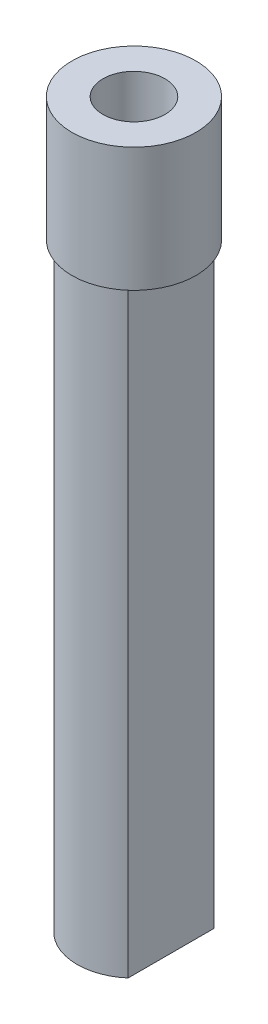
ISO-10303-21;
HEADER;
FILE_DESCRIPTION(('STEP AP214'),'2;1');
FILE_NAME('part.step','',(''),(''),'','','');
FILE_SCHEMA(('AUTOMOTIVE_DESIGN { 1 0 10303 214 1 1 1 1 }'));
ENDSEC;
DATA;
#1=APPLICATION_CONTEXT('core data for automotive mechanical design processes');
#2=APPLICATION_PROTOCOL_DEFINITION('international standard','automotive_design',2000,#1);
#3=PRODUCT_CONTEXT('',#1,'mechanical');
#4=PRODUCT('Part','Part','',(#3));
#5=PRODUCT_RELATED_PRODUCT_CATEGORY('part','',(#4));
#6=PRODUCT_DEFINITION_FORMATION('','',#4);
#7=PRODUCT_DEFINITION_CONTEXT('part definition',#1,'design');
#8=PRODUCT_DEFINITION('design','',#6,#7);
#9=PRODUCT_DEFINITION_SHAPE('','',#8);
#10=(LENGTH_UNIT() NAMED_UNIT(*) SI_UNIT(.MILLI.,.METRE.));
#11=(NAMED_UNIT(*) PLANE_ANGLE_UNIT() SI_UNIT($,.RADIAN.));
#12=(NAMED_UNIT(*) SI_UNIT($,.STERADIAN.) SOLID_ANGLE_UNIT());
#13=UNCERTAINTY_MEASURE_WITH_UNIT(LENGTH_MEASURE(1.E-05),#10,'distance_accuracy_value','');
#14=(GEOMETRIC_REPRESENTATION_CONTEXT(3) GLOBAL_UNCERTAINTY_ASSIGNED_CONTEXT((#13)) GLOBAL_UNIT_ASSIGNED_CONTEXT((#10,
#11,#12)) REPRESENTATION_CONTEXT('',''));
#15=CARTESIAN_POINT('',(0.,0.,0.));
#16=DIRECTION('',(0.,0.,1.));
#17=DIRECTION('',(1.,0.,0.));
#18=AXIS2_PLACEMENT_3D('',#15,#16,#17);
#19=CARTESIAN_POINT('',(0.,0.,0.));
#20=DIRECTION('',(0.,1.,0.));
#21=DIRECTION('',(0.,0.,1.));
#22=AXIS2_PLACEMENT_3D('',#19,#20,#21);
#23=PLANE('',#22);
#24=CARTESIAN_POINT('',(0.,0.,0.));
#25=DIRECTION('',(0.,1.,0.));
#26=DIRECTION('',(0.,0.,1.));
#27=AXIS2_PLACEMENT_3D('',#24,#25,#26);
#28=CIRCLE('',#27,3.);
#29=CARTESIAN_POINT('',(0.,0.,3.));
#30=VERTEX_POINT('',#29);
#31=EDGE_CURVE('E49',#30,#30,#28,.T.);
#32=ORIENTED_EDGE('',*,*,#31,.F.);
#33=EDGE_LOOP('',(#32));
#34=FACE_BOUND('',#33,.T.);
#35=CARTESIAN_POINT('',(0.,0.,0.));
#36=DIRECTION('',(0.,-1.,0.));
#37=DIRECTION('',(0.,0.,-1.));
#38=AXIS2_PLACEMENT_3D('',#35,#36,#37);
#39=CIRCLE('',#38,2.75);
#40=CARTESIAN_POINT('',(1.79891634046723,0.,2.08));
#41=VERTEX_POINT('',#40);
#42=CARTESIAN_POINT('',(-1.79891634046723,0.,2.08));
#43=VERTEX_POINT('',#42);
#44=EDGE_CURVE('E115',#41,#43,#39,.T.);
#45=ORIENTED_EDGE('',*,*,#44,.F.);
#46=DIRECTION('',(0.,0.,-1.));
#47=VECTOR('',#46,1.);
#48=CARTESIAN_POINT('',(1.79891634046723,0.,0.));
#49=LINE('',#48,#47);
#50=CARTESIAN_POINT('',(1.79891634046723,0.,-2.08));
#51=VERTEX_POINT('',#50);
#52=EDGE_CURVE('E61',#41,#51,#49,.T.);
#53=ORIENTED_EDGE('',*,*,#52,.T.);
#54=CARTESIAN_POINT('',(-1.79891634046723,0.,-2.08));
#55=VERTEX_POINT('',#54);
#56=EDGE_CURVE('E66',#55,#51,#39,.T.);
#57=ORIENTED_EDGE('',*,*,#56,.F.);
#58=DIRECTION('',(0.,0.,-1.));
#59=VECTOR('',#58,1.);
#60=CARTESIAN_POINT('',(-1.79891634046723,0.,0.));
#61=LINE('',#60,#59);
#62=EDGE_CURVE('E113',#43,#55,#61,.T.);
#63=ORIENTED_EDGE('',*,*,#62,.F.);
#64=EDGE_LOOP('',(#45,#53,#57,#63));
#65=FACE_BOUND('',#64,.T.);
#66=ADVANCED_FACE('F45',(#34,#65),#23,.F.);
#67=CARTESIAN_POINT('',(0.,6.,0.));
#68=DIRECTION('',(0.,-1.,0.));
#69=DIRECTION('',(0.,0.,-1.));
#70=AXIS2_PLACEMENT_3D('',#67,#68,#69);
#71=CYLINDRICAL_SURFACE('',#70,3.);
#72=CARTESIAN_POINT('',(0.,6.,0.));
#73=DIRECTION('',(0.,1.,0.));
#74=DIRECTION('',(0.,0.,1.));
#75=AXIS2_PLACEMENT_3D('',#72,#73,#74);
#76=CIRCLE('',#75,3.);
#77=CARTESIAN_POINT('',(0.,6.,3.));
#78=VERTEX_POINT('',#77);
#79=EDGE_CURVE('E11',#78,#78,#76,.T.);
#80=ORIENTED_EDGE('',*,*,#79,.F.);
#81=EDGE_LOOP('',(#80));
#82=FACE_BOUND('',#81,.T.);
#83=ORIENTED_EDGE('',*,*,#31,.T.);
#84=EDGE_LOOP('',(#83));
#85=FACE_BOUND('',#84,.T.);
#86=ADVANCED_FACE('F47',(#82,#85),#71,.T.);
#87=CARTESIAN_POINT('',(0.,6.,0.));
#88=DIRECTION('',(0.,1.,0.));
#89=DIRECTION('',(0.,0.,1.));
#90=AXIS2_PLACEMENT_3D('',#87,#88,#89);
#91=PLANE('',#90);
#92=CARTESIAN_POINT('',(0.,6.,0.));
#93=DIRECTION('',(0.,1.,0.));
#94=DIRECTION('',(0.,0.,1.));
#95=AXIS2_PLACEMENT_3D('',#92,#93,#94);
#96=CIRCLE('',#95,1.5);
#97=CARTESIAN_POINT('',(0.,6.,1.5));
#98=VERTEX_POINT('',#97);
#99=EDGE_CURVE('E94',#98,#98,#96,.T.);
#100=ORIENTED_EDGE('',*,*,#99,.F.);
#101=EDGE_LOOP('',(#100));
#102=FACE_BOUND('',#101,.T.);
#103=ORIENTED_EDGE('',*,*,#79,.T.);
#104=EDGE_LOOP('',(#103));
#105=FACE_BOUND('',#104,.T.);
#106=ADVANCED_FACE('F143',(#102,#105),#91,.T.);
#107=CARTESIAN_POINT('',(0.,3.,0.));
#108=DIRECTION('',(0.,1.,0.));
#109=DIRECTION('',(0.,0.,1.));
#110=AXIS2_PLACEMENT_3D('',#107,#108,#109);
#111=CYLINDRICAL_SURFACE('',#110,1.5);
#112=CARTESIAN_POINT('',(0.,3.,0.));
#113=DIRECTION('',(0.,1.,0.));
#114=DIRECTION('',(0.,0.,1.));
#115=AXIS2_PLACEMENT_3D('',#112,#113,#114);
#116=CIRCLE('',#115,1.5);
#117=CARTESIAN_POINT('',(0.,3.,1.5));
#118=VERTEX_POINT('',#117);
#119=EDGE_CURVE('E133',#118,#118,#116,.T.);
#120=ORIENTED_EDGE('',*,*,#119,.F.);
#121=EDGE_LOOP('',(#120));
#122=FACE_BOUND('',#121,.T.);
#123=ORIENTED_EDGE('',*,*,#99,.T.);
#124=EDGE_LOOP('',(#123));
#125=FACE_BOUND('',#124,.T.);
#126=ADVANCED_FACE('F141',(#122,#125),#111,.F.);
#127=CARTESIAN_POINT('',(0.,3.,0.));
#128=DIRECTION('',(0.,1.,0.));
#129=DIRECTION('',(0.,0.,1.));
#130=AXIS2_PLACEMENT_3D('',#127,#128,#129);
#131=PLANE('',#130);
#132=ORIENTED_EDGE('',*,*,#119,.T.);
#133=EDGE_LOOP('',(#132));
#134=FACE_BOUND('',#133,.T.);
#135=ADVANCED_FACE('F174',(#134),#131,.T.);
#136=CARTESIAN_POINT('',(1.79891634046723,-29.,0.));
#137=DIRECTION('',(1.,0.,0.));
#138=DIRECTION('',(0.,0.,-1.));
#139=AXIS2_PLACEMENT_3D('',#136,#137,#138);
#140=PLANE('',#139);
#141=ORIENTED_EDGE('',*,*,#52,.F.);
#142=DIRECTION('',(0.,1.,0.));
#143=VECTOR('',#142,1.);
#144=CARTESIAN_POINT('',(1.79891634046723,-29.,2.08));
#145=LINE('',#144,#143);
#146=CARTESIAN_POINT('',(1.79891634046723,-29.,2.08));
#147=VERTEX_POINT('',#146);
#148=EDGE_CURVE('E86',#147,#41,#145,.T.);
#149=ORIENTED_EDGE('',*,*,#148,.F.);
#150=DIRECTION('',(0.,0.,-1.));
#151=VECTOR('',#150,1.);
#152=CARTESIAN_POINT('',(1.79891634046723,-29.,0.));
#153=LINE('',#152,#151);
#154=CARTESIAN_POINT('',(1.79891634046723,-29.,-2.08));
#155=VERTEX_POINT('',#154);
#156=EDGE_CURVE('E90',#147,#155,#153,.T.);
#157=ORIENTED_EDGE('',*,*,#156,.T.);
#158=DIRECTION('',(0.,1.,0.));
#159=VECTOR('',#158,1.);
#160=CARTESIAN_POINT('',(1.79891634046723,-29.,-2.08));
#161=LINE('',#160,#159);
#162=EDGE_CURVE('E124',#155,#51,#161,.T.);
#163=ORIENTED_EDGE('',*,*,#162,.T.);
#164=EDGE_LOOP('',(#141,#149,#157,#163));
#165=FACE_BOUND('',#164,.T.);
#166=ADVANCED_FACE('F88',(#165),#140,.T.);
#167=CARTESIAN_POINT('',(0.,-29.,0.));
#168=DIRECTION('',(0.,1.,0.));
#169=DIRECTION('',(0.,0.,1.));
#170=AXIS2_PLACEMENT_3D('',#167,#168,#169);
#171=CYLINDRICAL_SURFACE('',#170,2.75);
#172=ORIENTED_EDGE('',*,*,#44,.T.);
#173=DIRECTION('',(0.,1.,0.));
#174=VECTOR('',#173,1.);
#175=CARTESIAN_POINT('',(-1.79891634046723,-29.,2.08));
#176=LINE('',#175,#174);
#177=CARTESIAN_POINT('',(-1.79891634046723,-29.,2.08));
#178=VERTEX_POINT('',#177);
#179=EDGE_CURVE('E95',#178,#43,#176,.T.);
#180=ORIENTED_EDGE('',*,*,#179,.F.);
#181=CARTESIAN_POINT('',(0.,-29.,0.));
#182=DIRECTION('',(0.,-1.,0.));
#183=DIRECTION('',(0.,0.,-1.));
#184=AXIS2_PLACEMENT_3D('',#181,#182,#183);
#185=CIRCLE('',#184,2.75);
#186=EDGE_CURVE('E98',#147,#178,#185,.T.);
#187=ORIENTED_EDGE('',*,*,#186,.F.);
#188=ORIENTED_EDGE('',*,*,#148,.T.);
#189=EDGE_LOOP('',(#172,#180,#187,#188));
#190=FACE_BOUND('',#189,.T.);
#191=ADVANCED_FACE('F99',(#190),#171,.T.);
#192=CARTESIAN_POINT('',(-1.79891634046723,-29.,0.));
#193=DIRECTION('',(1.,0.,0.));
#194=DIRECTION('',(0.,0.,-1.));
#195=AXIS2_PLACEMENT_3D('',#192,#193,#194);
#196=PLANE('',#195);
#197=ORIENTED_EDGE('',*,*,#62,.T.);
#198=DIRECTION('',(0.,1.,0.));
#199=VECTOR('',#198,1.);
#200=CARTESIAN_POINT('',(-1.79891634046723,-29.,-2.08));
#201=LINE('',#200,#199);
#202=CARTESIAN_POINT('',(-1.79891634046723,-29.,-2.08));
#203=VERTEX_POINT('',#202);
#204=EDGE_CURVE('E127',#203,#55,#201,.T.);
#205=ORIENTED_EDGE('',*,*,#204,.F.);
#206=DIRECTION('',(0.,0.,-1.));
#207=VECTOR('',#206,1.);
#208=CARTESIAN_POINT('',(-1.79891634046723,-29.,0.));
#209=LINE('',#208,#207);
#210=EDGE_CURVE('E104',#178,#203,#209,.T.);
#211=ORIENTED_EDGE('',*,*,#210,.F.);
#212=ORIENTED_EDGE('',*,*,#179,.T.);
#213=EDGE_LOOP('',(#197,#205,#211,#212));
#214=FACE_BOUND('',#213,.T.);
#215=ADVANCED_FACE('F157',(#214),#196,.F.);
#216=ORIENTED_EDGE('',*,*,#56,.T.);
#217=ORIENTED_EDGE('',*,*,#162,.F.);
#218=EDGE_CURVE('E106',#203,#155,#185,.T.);
#219=ORIENTED_EDGE('',*,*,#218,.F.);
#220=ORIENTED_EDGE('',*,*,#204,.T.);
#221=EDGE_LOOP('',(#216,#217,#219,#220));
#222=FACE_BOUND('',#221,.T.);
#223=ADVANCED_FACE('F160',(#222),#171,.T.);
#224=CARTESIAN_POINT('',(0.,-29.,0.));
#225=DIRECTION('',(0.,-1.,0.));
#226=DIRECTION('',(0.,0.,-1.));
#227=AXIS2_PLACEMENT_3D('',#224,#225,#226);
#228=PLANE('',#227);
#229=ORIENTED_EDGE('',*,*,#156,.F.);
#230=ORIENTED_EDGE('',*,*,#186,.T.);
#231=ORIENTED_EDGE('',*,*,#210,.T.);
#232=ORIENTED_EDGE('',*,*,#218,.T.);
#233=EDGE_LOOP('',(#229,#230,#231,#232));
#234=FACE_BOUND('',#233,.T.);
#235=ADVANCED_FACE('F107',(#234),#228,.T.);
#236=CLOSED_SHELL('',(#66,#86,#106,#126,#135,#166,#191,#215,#223,#235));
#237=MANIFOLD_SOLID_BREP('B2',#236);
#238=ADVANCED_BREP_SHAPE_REPRESENTATION('',(#18,#237),#14);
#239=SHAPE_DEFINITION_REPRESENTATION(#9,#238);
ENDSEC;
END-ISO-10303-21;
